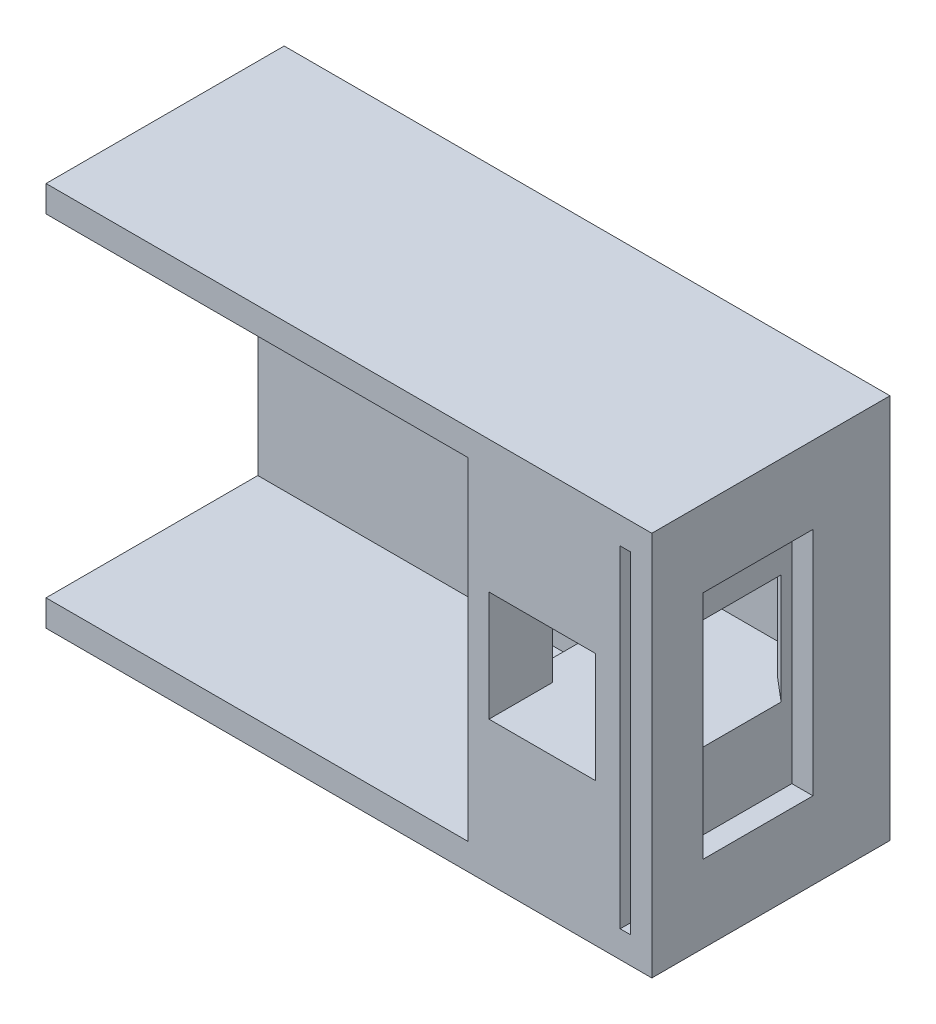
ISO-10303-21;
HEADER;
FILE_DESCRIPTION(('STEP AP214'),'2;1');
FILE_NAME('part.step','',(''),(''),'','','');
FILE_SCHEMA(('AUTOMOTIVE_DESIGN { 1 0 10303 214 1 1 1 1 }'));
ENDSEC;
DATA;
#1=APPLICATION_CONTEXT('core data for automotive mechanical design processes');
#2=APPLICATION_PROTOCOL_DEFINITION('international standard','automotive_design',2000,#1);
#3=PRODUCT_CONTEXT('',#1,'mechanical');
#4=PRODUCT('Part','Part','',(#3));
#5=PRODUCT_RELATED_PRODUCT_CATEGORY('part','',(#4));
#6=PRODUCT_DEFINITION_FORMATION('','',#4);
#7=PRODUCT_DEFINITION_CONTEXT('part definition',#1,'design');
#8=PRODUCT_DEFINITION('design','',#6,#7);
#9=PRODUCT_DEFINITION_SHAPE('','',#8);
#10=(LENGTH_UNIT() NAMED_UNIT(*) SI_UNIT(.MILLI.,.METRE.));
#11=(NAMED_UNIT(*) PLANE_ANGLE_UNIT() SI_UNIT($,.RADIAN.));
#12=(NAMED_UNIT(*) SI_UNIT($,.STERADIAN.) SOLID_ANGLE_UNIT());
#13=UNCERTAINTY_MEASURE_WITH_UNIT(LENGTH_MEASURE(1.E-05),#10,'distance_accuracy_value','');
#14=(GEOMETRIC_REPRESENTATION_CONTEXT(3) GLOBAL_UNCERTAINTY_ASSIGNED_CONTEXT((#13)) GLOBAL_UNIT_ASSIGNED_CONTEXT((#10,
#11,#12)) REPRESENTATION_CONTEXT('',''));
#15=CARTESIAN_POINT('',(0.,0.,0.));
#16=DIRECTION('',(0.,0.,1.));
#17=DIRECTION('',(1.,0.,0.));
#18=AXIS2_PLACEMENT_3D('',#15,#16,#17);
#19=CARTESIAN_POINT('',(101.6,0.,0.));
#20=DIRECTION('',(-1.,0.,0.));
#21=DIRECTION('',(0.,0.,1.));
#22=AXIS2_PLACEMENT_3D('',#19,#20,#21);
#23=PLANE('',#22);
#24=DIRECTION('',(0.,0.,1.));
#25=VECTOR('',#24,1.);
#26=CARTESIAN_POINT('',(101.6,-6.,-2.54));
#27=LINE('',#26,#25);
#28=CARTESIAN_POINT('',(101.6,-6.,-2.54));
#29=VERTEX_POINT('',#28);
#30=CARTESIAN_POINT('',(101.6,-6.,2.54000000000001));
#31=VERTEX_POINT('',#30);
#32=EDGE_CURVE('E362',#29,#31,#27,.T.);
#33=ORIENTED_EDGE('',*,*,#32,.F.);
#34=DIRECTION('',(0.,1.,0.));
#35=VECTOR('',#34,1.);
#36=CARTESIAN_POINT('',(101.6,-6.,-2.54));
#37=LINE('',#36,#35);
#38=CARTESIAN_POINT('',(101.6,7.26,-2.54));
#39=VERTEX_POINT('',#38);
#40=EDGE_CURVE('E402',#29,#39,#37,.T.);
#41=ORIENTED_EDGE('',*,*,#40,.T.);
#42=DIRECTION('',(0.,0.,1.));
#43=VECTOR('',#42,1.);
#44=CARTESIAN_POINT('',(101.6,7.26,-2.54));
#45=LINE('',#44,#43);
#46=CARTESIAN_POINT('',(101.6,7.26,2.54000000000001));
#47=VERTEX_POINT('',#46);
#48=EDGE_CURVE('E332',#39,#47,#45,.T.);
#49=ORIENTED_EDGE('',*,*,#48,.T.);
#50=DIRECTION('',(0.,1.,0.));
#51=VECTOR('',#50,1.);
#52=CARTESIAN_POINT('',(101.6,-6.,2.54000000000001));
#53=LINE('',#52,#51);
#54=EDGE_CURVE('E398',#31,#47,#53,.T.);
#55=ORIENTED_EDGE('',*,*,#54,.F.);
#56=EDGE_LOOP('',(#33,#41,#49,#55));
#57=FACE_BOUND('',#56,.T.);
#58=DIRECTION('',(0.,1.,0.));
#59=VECTOR('',#58,1.);
#60=CARTESIAN_POINT('',(101.6,23.1902,-12.7508));
#61=LINE('',#60,#59);
#62=CARTESIAN_POINT('',(101.6,-20.0152,-12.7508));
#63=VERTEX_POINT('',#62);
#64=CARTESIAN_POINT('',(101.6,20.0152,-12.7508));
#65=VERTEX_POINT('',#64);
#66=EDGE_CURVE('E401',#63,#65,#61,.T.);
#67=ORIENTED_EDGE('',*,*,#66,.F.);
#68=DIRECTION('',(0.,0.,-1.));
#69=VECTOR('',#68,1.);
#70=CARTESIAN_POINT('',(101.6,-20.0152,-12.7508));
#71=LINE('',#70,#69);
#72=CARTESIAN_POINT('',(101.6,-20.0152,12.7508));
#73=VERTEX_POINT('',#72);
#74=EDGE_CURVE('E253',#73,#63,#71,.T.);
#75=ORIENTED_EDGE('',*,*,#74,.F.);
#76=DIRECTION('',(0.,-1.,0.));
#77=VECTOR('',#76,1.);
#78=CARTESIAN_POINT('',(101.6,-23.1902,12.7508));
#79=LINE('',#78,#77);
#80=CARTESIAN_POINT('',(101.6,20.0152,12.7508));
#81=VERTEX_POINT('',#80);
#82=EDGE_CURVE('E432',#81,#73,#79,.T.);
#83=ORIENTED_EDGE('',*,*,#82,.F.);
#84=DIRECTION('',(0.,0.,-1.));
#85=VECTOR('',#84,1.);
#86=CARTESIAN_POINT('',(101.6,20.0152,12.7508));
#87=LINE('',#86,#85);
#88=EDGE_CURVE('E445',#81,#65,#87,.T.);
#89=ORIENTED_EDGE('',*,*,#88,.T.);
#90=EDGE_LOOP('',(#67,#75,#83,#89));
#91=FACE_BOUND('',#90,.T.);
#92=ADVANCED_FACE('F33',(#57,#91),#23,.T.);
#93=CARTESIAN_POINT('',(119.9388,0.,0.));
#94=DIRECTION('',(-1.,0.,0.));
#95=DIRECTION('',(0.,0.,1.));
#96=AXIS2_PLACEMENT_3D('',#93,#94,#95);
#97=PLANE('',#96);
#98=DIRECTION('',(0.,1.,0.));
#99=VECTOR('',#98,1.);
#100=CARTESIAN_POINT('',(119.9388,-6.,-6.62939999999999));
#101=LINE('',#100,#99);
#102=CARTESIAN_POINT('',(119.9388,-6.,-6.62939999999999));
#103=VERTEX_POINT('',#102);
#104=CARTESIAN_POINT('',(119.9388,7.26,-6.62939999999999));
#105=VERTEX_POINT('',#104);
#106=EDGE_CURVE('E414',#103,#105,#101,.T.);
#107=ORIENTED_EDGE('',*,*,#106,.F.);
#108=DIRECTION('',(0.,0.,-1.));
#109=VECTOR('',#108,1.);
#110=CARTESIAN_POINT('',(119.9388,-6.,6.6294));
#111=LINE('',#110,#109);
#112=CARTESIAN_POINT('',(119.9388,-6.,6.6294));
#113=VERTEX_POINT('',#112);
#114=EDGE_CURVE('E344',#113,#103,#111,.T.);
#115=ORIENTED_EDGE('',*,*,#114,.F.);
#116=DIRECTION('',(0.,1.,0.));
#117=VECTOR('',#116,1.);
#118=CARTESIAN_POINT('',(119.9388,-6.,6.6294));
#119=LINE('',#118,#117);
#120=CARTESIAN_POINT('',(119.9388,7.26,6.6294));
#121=VERTEX_POINT('',#120);
#122=EDGE_CURVE('E417',#113,#121,#119,.T.);
#123=ORIENTED_EDGE('',*,*,#122,.T.);
#124=DIRECTION('',(0.,0.,-1.));
#125=VECTOR('',#124,1.);
#126=CARTESIAN_POINT('',(119.9388,7.26,6.6294));
#127=LINE('',#126,#125);
#128=EDGE_CURVE('E380',#121,#105,#127,.T.);
#129=ORIENTED_EDGE('',*,*,#128,.T.);
#130=EDGE_LOOP('',(#107,#115,#123,#129));
#131=FACE_BOUND('',#130,.T.);
#132=DIRECTION('',(0.,0.,1.));
#133=VECTOR('',#132,1.);
#134=CARTESIAN_POINT('',(119.9388,-19.9644,12.7508));
#135=LINE('',#134,#133);
#136=CARTESIAN_POINT('',(119.9388,-19.9644,-12.7));
#137=VERTEX_POINT('',#136);
#138=CARTESIAN_POINT('',(119.9388,-19.9644,12.7508));
#139=VERTEX_POINT('',#138);
#140=EDGE_CURVE('E56',#137,#139,#135,.T.);
#141=ORIENTED_EDGE('',*,*,#140,.F.);
#142=DIRECTION('',(0.,-1.,0.));
#143=VECTOR('',#142,1.);
#144=CARTESIAN_POINT('',(119.9388,-19.9644,-12.7));
#145=LINE('',#144,#143);
#146=CARTESIAN_POINT('',(119.9388,19.9644,-12.7));
#147=VERTEX_POINT('',#146);
#148=EDGE_CURVE('E313',#147,#137,#145,.T.);
#149=ORIENTED_EDGE('',*,*,#148,.F.);
#150=DIRECTION('',(0.,0.,-1.));
#151=VECTOR('',#150,1.);
#152=CARTESIAN_POINT('',(119.9388,19.9644,-12.7));
#153=LINE('',#152,#151);
#154=CARTESIAN_POINT('',(119.9388,19.9644,12.7508));
#155=VERTEX_POINT('',#154);
#156=EDGE_CURVE('E298',#155,#147,#153,.T.);
#157=ORIENTED_EDGE('',*,*,#156,.F.);
#158=DIRECTION('',(0.,-1.,0.));
#159=VECTOR('',#158,1.);
#160=CARTESIAN_POINT('',(119.9388,-23.1902,12.7508));
#161=LINE('',#160,#159);
#162=EDGE_CURVE('E429',#155,#139,#161,.T.);
#163=ORIENTED_EDGE('',*,*,#162,.T.);
#164=EDGE_LOOP('',(#141,#149,#157,#163));
#165=FACE_BOUND('',#164,.T.);
#166=ADVANCED_FACE('F468',(#131,#165),#97,.F.);
#167=CARTESIAN_POINT('',(50.8,20.0152,-12.7508));
#168=DIRECTION('',(-1.,0.,0.));
#169=DIRECTION('',(0.,0.,1.));
#170=AXIS2_PLACEMENT_3D('',#167,#168,#169);
#171=PLANE('',#170);
#172=DIRECTION('',(0.,0.,1.));
#173=VECTOR('',#172,1.);
#174=CARTESIAN_POINT('',(50.8,23.1902,-12.7508));
#175=LINE('',#174,#173);
#176=CARTESIAN_POINT('',(50.8,23.1902,-15.9258));
#177=VERTEX_POINT('',#176);
#178=CARTESIAN_POINT('',(50.8,23.1902,12.7508));
#179=VERTEX_POINT('',#178);
#180=EDGE_CURVE('E438',#177,#179,#175,.T.);
#181=ORIENTED_EDGE('',*,*,#180,.F.);
#182=DIRECTION('',(0.,1.,0.));
#183=VECTOR('',#182,1.);
#184=CARTESIAN_POINT('',(50.8,23.1902,-15.9258));
#185=LINE('',#184,#183);
#186=CARTESIAN_POINT('',(50.8,-23.1902,-15.9258));
#187=VERTEX_POINT('',#186);
#188=EDGE_CURVE('E246',#187,#177,#185,.T.);
#189=ORIENTED_EDGE('',*,*,#188,.F.);
#190=DIRECTION('',(0.,0.,1.));
#191=VECTOR('',#190,1.);
#192=CARTESIAN_POINT('',(50.8,-23.1902,12.7508));
#193=LINE('',#192,#191);
#194=CARTESIAN_POINT('',(50.8,-23.1902,12.7508));
#195=VERTEX_POINT('',#194);
#196=EDGE_CURVE('E255',#187,#195,#193,.T.);
#197=ORIENTED_EDGE('',*,*,#196,.T.);
#198=DIRECTION('',(0.,1.,0.));
#199=VECTOR('',#198,1.);
#200=CARTESIAN_POINT('',(50.8,-20.0152,12.7508));
#201=LINE('',#200,#199);
#202=CARTESIAN_POINT('',(50.8,-20.0152,12.7508));
#203=VERTEX_POINT('',#202);
#204=EDGE_CURVE('E258',#195,#203,#201,.T.);
#205=ORIENTED_EDGE('',*,*,#204,.T.);
#206=DIRECTION('',(0.,0.,-1.));
#207=VECTOR('',#206,1.);
#208=CARTESIAN_POINT('',(50.8,-20.0152,-12.7508));
#209=LINE('',#208,#207);
#210=CARTESIAN_POINT('',(50.8,-20.0152,-12.7508));
#211=VERTEX_POINT('',#210);
#212=EDGE_CURVE('E260',#203,#211,#209,.T.);
#213=ORIENTED_EDGE('',*,*,#212,.T.);
#214=DIRECTION('',(0.,1.,0.));
#215=VECTOR('',#214,1.);
#216=CARTESIAN_POINT('',(50.8,23.1902,-12.7508));
#217=LINE('',#216,#215);
#218=CARTESIAN_POINT('',(50.8,20.0152,-12.7508));
#219=VERTEX_POINT('',#218);
#220=EDGE_CURVE('E247',#211,#219,#217,.T.);
#221=ORIENTED_EDGE('',*,*,#220,.T.);
#222=DIRECTION('',(0.,0.,1.));
#223=VECTOR('',#222,1.);
#224=CARTESIAN_POINT('',(50.8,20.0152,-12.7508));
#225=LINE('',#224,#223);
#226=CARTESIAN_POINT('',(50.8,20.0152,12.7508));
#227=VERTEX_POINT('',#226);
#228=EDGE_CURVE('E439',#219,#227,#225,.T.);
#229=ORIENTED_EDGE('',*,*,#228,.T.);
#230=DIRECTION('',(0.,1.,0.));
#231=VECTOR('',#230,1.);
#232=CARTESIAN_POINT('',(50.8,20.0152,12.7508));
#233=LINE('',#232,#231);
#234=EDGE_CURVE('E11',#227,#179,#233,.T.);
#235=ORIENTED_EDGE('',*,*,#234,.T.);
#236=EDGE_LOOP('',(#181,#189,#197,#205,#213,#221,#229,#235));
#237=FACE_BOUND('',#236,.T.);
#238=ADVANCED_FACE('F35',(#237),#171,.T.);
#239=CARTESIAN_POINT('',(50.8,20.0152,12.7508));
#240=DIRECTION('',(0.,0.,1.));
#241=DIRECTION('',(1.,0.,0.));
#242=AXIS2_PLACEMENT_3D('',#239,#240,#241);
#243=PLANE('',#242);
#244=DIRECTION('',(-1.,0.,0.));
#245=VECTOR('',#244,1.);
#246=CARTESIAN_POINT('',(121.2088,19.9644,12.7508));
#247=LINE('',#246,#245);
#248=CARTESIAN_POINT('',(121.2088,19.9644,12.7508));
#249=VERTEX_POINT('',#248);
#250=EDGE_CURVE('E324',#249,#155,#247,.T.);
#251=ORIENTED_EDGE('',*,*,#250,.F.);
#252=DIRECTION('',(0.,-1.,0.));
#253=VECTOR('',#252,1.);
#254=CARTESIAN_POINT('',(121.2088,-23.1902,12.7508));
#255=LINE('',#254,#253);
#256=CARTESIAN_POINT('',(121.2088,-19.9644,12.7508));
#257=VERTEX_POINT('',#256);
#258=EDGE_CURVE('E230',#249,#257,#255,.T.);
#259=ORIENTED_EDGE('',*,*,#258,.T.);
#260=DIRECTION('',(-1.,0.,0.));
#261=VECTOR('',#260,1.);
#262=CARTESIAN_POINT('',(121.2088,-19.9644,12.7508));
#263=LINE('',#262,#261);
#264=EDGE_CURVE('E310',#257,#139,#263,.T.);
#265=ORIENTED_EDGE('',*,*,#264,.T.);
#266=ORIENTED_EDGE('',*,*,#162,.F.);
#267=EDGE_LOOP('',(#251,#259,#265,#266));
#268=FACE_BOUND('',#267,.T.);
#269=DIRECTION('',(1.,0.,0.));
#270=VECTOR('',#269,1.);
#271=CARTESIAN_POINT('',(104.14,-6.,12.7508));
#272=LINE('',#271,#270);
#273=CARTESIAN_POINT('',(104.14,-6.,12.7508));
#274=VERTEX_POINT('',#273);
#275=CARTESIAN_POINT('',(116.94,-6.,12.7508));
#276=VERTEX_POINT('',#275);
#277=EDGE_CURVE('E335',#274,#276,#272,.T.);
#278=ORIENTED_EDGE('',*,*,#277,.F.);
#279=DIRECTION('',(0.,1.,0.));
#280=VECTOR('',#279,1.);
#281=CARTESIAN_POINT('',(104.14,-6.,12.7508));
#282=LINE('',#281,#280);
#283=CARTESIAN_POINT('',(104.14,7.26,12.7508));
#284=VERTEX_POINT('',#283);
#285=EDGE_CURVE('E425',#274,#284,#282,.T.);
#286=ORIENTED_EDGE('',*,*,#285,.T.);
#287=DIRECTION('',(1.,0.,0.));
#288=VECTOR('',#287,1.);
#289=CARTESIAN_POINT('',(104.14,7.26,12.7508));
#290=LINE('',#289,#288);
#291=CARTESIAN_POINT('',(116.94,7.26,12.7508));
#292=VERTEX_POINT('',#291);
#293=EDGE_CURVE('E371',#284,#292,#290,.T.);
#294=ORIENTED_EDGE('',*,*,#293,.T.);
#295=DIRECTION('',(0.,1.,0.));
#296=VECTOR('',#295,1.);
#297=CARTESIAN_POINT('',(116.94,-6.,12.7508));
#298=LINE('',#297,#296);
#299=EDGE_CURVE('E422',#276,#292,#298,.T.);
#300=ORIENTED_EDGE('',*,*,#299,.F.);
#301=EDGE_LOOP('',(#278,#286,#294,#300));
#302=FACE_BOUND('',#301,.T.);
#303=DIRECTION('',(1.,0.,0.));
#304=VECTOR('',#303,1.);
#305=CARTESIAN_POINT('',(50.8,23.1902,12.7508));
#306=LINE('',#305,#304);
#307=CARTESIAN_POINT('',(123.7488,23.1902,12.7508));
#308=VERTEX_POINT('',#307);
#309=EDGE_CURVE('E225',#179,#308,#306,.T.);
#310=ORIENTED_EDGE('',*,*,#309,.F.);
#311=ORIENTED_EDGE('',*,*,#234,.F.);
#312=DIRECTION('',(1.,0.,0.));
#313=VECTOR('',#312,1.);
#314=CARTESIAN_POINT('',(50.8,20.0152,12.7508));
#315=LINE('',#314,#313);
#316=EDGE_CURVE('E442',#227,#81,#315,.T.);
#317=ORIENTED_EDGE('',*,*,#316,.T.);
#318=ORIENTED_EDGE('',*,*,#82,.T.);
#319=DIRECTION('',(1.,0.,0.));
#320=VECTOR('',#319,1.);
#321=CARTESIAN_POINT('',(50.8,-20.0152,12.7508));
#322=LINE('',#321,#320);
#323=EDGE_CURVE('E48',#203,#73,#322,.T.);
#324=ORIENTED_EDGE('',*,*,#323,.F.);
#325=ORIENTED_EDGE('',*,*,#204,.F.);
#326=DIRECTION('',(-1.,0.,0.));
#327=VECTOR('',#326,1.);
#328=CARTESIAN_POINT('',(119.9388,-23.1902,12.7508));
#329=LINE('',#328,#327);
#330=CARTESIAN_POINT('',(123.7488,-23.1902,12.7508));
#331=VERTEX_POINT('',#330);
#332=EDGE_CURVE('E431',#331,#195,#329,.T.);
#333=ORIENTED_EDGE('',*,*,#332,.F.);
#334=DIRECTION('',(0.,-1.,0.));
#335=VECTOR('',#334,1.);
#336=CARTESIAN_POINT('',(123.7488,-23.1902,12.7508));
#337=LINE('',#336,#335);
#338=EDGE_CURVE('E229',#308,#331,#337,.T.);
#339=ORIENTED_EDGE('',*,*,#338,.F.);
#340=EDGE_LOOP('',(#310,#311,#317,#318,#324,#325,#333,#339));
#341=FACE_BOUND('',#340,.T.);
#342=ADVANCED_FACE('F453',(#268,#302,#341),#243,.T.);
#343=CARTESIAN_POINT('',(0.,20.0152,0.));
#344=DIRECTION('',(0.,1.,0.));
#345=DIRECTION('',(0.,0.,1.));
#346=AXIS2_PLACEMENT_3D('',#343,#344,#345);
#347=PLANE('',#346);
#348=ORIENTED_EDGE('',*,*,#228,.F.);
#349=DIRECTION('',(-1.,0.,0.));
#350=VECTOR('',#349,1.);
#351=CARTESIAN_POINT('',(101.6,20.0152,-12.7508));
#352=LINE('',#351,#350);
#353=EDGE_CURVE('E41',#65,#219,#352,.T.);
#354=ORIENTED_EDGE('',*,*,#353,.F.);
#355=ORIENTED_EDGE('',*,*,#88,.F.);
#356=ORIENTED_EDGE('',*,*,#316,.F.);
#357=EDGE_LOOP('',(#348,#354,#355,#356));
#358=FACE_BOUND('',#357,.T.);
#359=ADVANCED_FACE('F465',(#358),#347,.F.);
#360=CARTESIAN_POINT('',(0.,23.1902,0.));
#361=DIRECTION('',(0.,1.,0.));
#362=DIRECTION('',(0.,0.,1.));
#363=AXIS2_PLACEMENT_3D('',#360,#361,#362);
#364=PLANE('',#363);
#365=ORIENTED_EDGE('',*,*,#180,.T.);
#366=ORIENTED_EDGE('',*,*,#309,.T.);
#367=DIRECTION('',(0.,0.,1.));
#368=VECTOR('',#367,1.);
#369=CARTESIAN_POINT('',(123.7488,23.1902,12.7508));
#370=LINE('',#369,#368);
#371=CARTESIAN_POINT('',(123.7488,23.1902,-15.9258));
#372=VERTEX_POINT('',#371);
#373=EDGE_CURVE('E218',#372,#308,#370,.T.);
#374=ORIENTED_EDGE('',*,*,#373,.F.);
#375=DIRECTION('',(1.,0.,0.));
#376=VECTOR('',#375,1.);
#377=CARTESIAN_POINT('',(123.7488,23.1902,-15.9258));
#378=LINE('',#377,#376);
#379=EDGE_CURVE('E223',#177,#372,#378,.T.);
#380=ORIENTED_EDGE('',*,*,#379,.F.);
#381=EDGE_LOOP('',(#365,#366,#374,#380));
#382=FACE_BOUND('',#381,.T.);
#383=ADVANCED_FACE('F221',(#382),#364,.T.);
#384=CARTESIAN_POINT('',(119.9388,-23.1902,-12.7508));
#385=DIRECTION('',(0.,1.,0.));
#386=DIRECTION('',(0.,0.,1.));
#387=AXIS2_PLACEMENT_3D('',#384,#385,#386);
#388=PLANE('',#387);
#389=ORIENTED_EDGE('',*,*,#332,.T.);
#390=ORIENTED_EDGE('',*,*,#196,.F.);
#391=DIRECTION('',(-1.,0.,0.));
#392=VECTOR('',#391,1.);
#393=CARTESIAN_POINT('',(50.8,-23.1902,-15.9258));
#394=LINE('',#393,#392);
#395=CARTESIAN_POINT('',(123.7488,-23.1902,-15.9258));
#396=VERTEX_POINT('',#395);
#397=EDGE_CURVE('E241',#396,#187,#394,.T.);
#398=ORIENTED_EDGE('',*,*,#397,.F.);
#399=DIRECTION('',(0.,0.,-1.));
#400=VECTOR('',#399,1.);
#401=CARTESIAN_POINT('',(123.7488,-23.1902,-12.7508));
#402=LINE('',#401,#400);
#403=EDGE_CURVE('E237',#331,#396,#402,.T.);
#404=ORIENTED_EDGE('',*,*,#403,.F.);
#405=EDGE_LOOP('',(#389,#390,#398,#404));
#406=FACE_BOUND('',#405,.T.);
#407=ADVANCED_FACE('F456',(#406),#388,.F.);
#408=CARTESIAN_POINT('',(101.6,-6.,2.54000000000001));
#409=DIRECTION('',(-0.707106781186547,0.,0.707106781186548));
#410=DIRECTION('',(0.707106781186548,0.,0.707106781186547));
#411=AXIS2_PLACEMENT_3D('',#408,#409,#410);
#412=PLANE('',#411);
#413=DIRECTION('',(0.707106781186548,0.,0.707106781186547));
#414=VECTOR('',#413,1.);
#415=CARTESIAN_POINT('',(101.6,7.26,2.54000000000001));
#416=LINE('',#415,#414);
#417=CARTESIAN_POINT('',(104.14,7.26,5.08000000000001));
#418=VERTEX_POINT('',#417);
#419=EDGE_CURVE('E327',#47,#418,#416,.T.);
#420=ORIENTED_EDGE('',*,*,#419,.T.);
#421=DIRECTION('',(0.,1.,0.));
#422=VECTOR('',#421,1.);
#423=CARTESIAN_POINT('',(104.14,-6.,5.08000000000001));
#424=LINE('',#423,#422);
#425=CARTESIAN_POINT('',(104.14,-6.,5.08000000000001));
#426=VERTEX_POINT('',#425);
#427=EDGE_CURVE('E365',#426,#418,#424,.T.);
#428=ORIENTED_EDGE('',*,*,#427,.F.);
#429=DIRECTION('',(0.707106781186548,0.,0.707106781186547));
#430=VECTOR('',#429,1.);
#431=CARTESIAN_POINT('',(101.6,-6.,2.54000000000001));
#432=LINE('',#431,#430);
#433=EDGE_CURVE('E328',#31,#426,#432,.T.);
#434=ORIENTED_EDGE('',*,*,#433,.F.);
#435=ORIENTED_EDGE('',*,*,#54,.T.);
#436=EDGE_LOOP('',(#420,#428,#434,#435));
#437=FACE_BOUND('',#436,.T.);
#438=ADVANCED_FACE('F481',(#437),#412,.F.);
#439=CARTESIAN_POINT('',(104.14,-6.,-5.07999999999999));
#440=DIRECTION('',(-0.707106781186547,0.,-0.707106781186548));
#441=DIRECTION('',(-0.707106781186548,0.,0.707106781186547));
#442=AXIS2_PLACEMENT_3D('',#439,#440,#441);
#443=PLANE('',#442);
#444=DIRECTION('',(-0.707106781186548,0.,0.707106781186547));
#445=VECTOR('',#444,1.);
#446=CARTESIAN_POINT('',(104.14,7.26,-5.07999999999999));
#447=LINE('',#446,#445);
#448=CARTESIAN_POINT('',(104.14,7.26,-5.07999999999999));
#449=VERTEX_POINT('',#448);
#450=EDGE_CURVE('E394',#449,#39,#447,.T.);
#451=ORIENTED_EDGE('',*,*,#450,.T.);
#452=ORIENTED_EDGE('',*,*,#40,.F.);
#453=DIRECTION('',(-0.707106781186548,0.,0.707106781186547));
#454=VECTOR('',#453,1.);
#455=CARTESIAN_POINT('',(104.14,-6.,-5.07999999999999));
#456=LINE('',#455,#454);
#457=CARTESIAN_POINT('',(104.14,-6.,-5.07999999999999));
#458=VERTEX_POINT('',#457);
#459=EDGE_CURVE('E359',#458,#29,#456,.T.);
#460=ORIENTED_EDGE('',*,*,#459,.F.);
#461=DIRECTION('',(0.,1.,0.));
#462=VECTOR('',#461,1.);
#463=CARTESIAN_POINT('',(104.14,-6.,-5.07999999999999));
#464=LINE('',#463,#462);
#465=EDGE_CURVE('E405',#458,#449,#464,.T.);
#466=ORIENTED_EDGE('',*,*,#465,.T.);
#467=EDGE_LOOP('',(#451,#452,#460,#466));
#468=FACE_BOUND('',#467,.T.);
#469=ADVANCED_FACE('F529',(#468),#443,.F.);
#470=CARTESIAN_POINT('',(104.14,-6.,-12.7508));
#471=DIRECTION('',(-1.,0.,0.));
#472=DIRECTION('',(0.,0.,1.));
#473=AXIS2_PLACEMENT_3D('',#470,#471,#472);
#474=PLANE('',#473);
#475=DIRECTION('',(0.,0.,1.));
#476=VECTOR('',#475,1.);
#477=CARTESIAN_POINT('',(104.14,7.26,-12.7508));
#478=LINE('',#477,#476);
#479=CARTESIAN_POINT('',(104.14,7.26,-12.7508));
#480=VERTEX_POINT('',#479);
#481=EDGE_CURVE('E391',#480,#449,#478,.T.);
#482=ORIENTED_EDGE('',*,*,#481,.T.);
#483=ORIENTED_EDGE('',*,*,#465,.F.);
#484=DIRECTION('',(0.,0.,1.));
#485=VECTOR('',#484,1.);
#486=CARTESIAN_POINT('',(104.14,-6.,-12.7508));
#487=LINE('',#486,#485);
#488=CARTESIAN_POINT('',(104.14,-6.,-12.7508));
#489=VERTEX_POINT('',#488);
#490=EDGE_CURVE('E356',#489,#458,#487,.T.);
#491=ORIENTED_EDGE('',*,*,#490,.F.);
#492=DIRECTION('',(0.,1.,0.));
#493=VECTOR('',#492,1.);
#494=CARTESIAN_POINT('',(104.14,-6.,-12.7508));
#495=LINE('',#494,#493);
#496=EDGE_CURVE('E407',#489,#480,#495,.T.);
#497=ORIENTED_EDGE('',*,*,#496,.T.);
#498=EDGE_LOOP('',(#482,#483,#491,#497));
#499=FACE_BOUND('',#498,.T.);
#500=ADVANCED_FACE('F511',(#499),#474,.F.);
#501=CARTESIAN_POINT('',(116.94,-6.,-9.16939999999999));
#502=DIRECTION('',(1.,0.,0.));
#503=DIRECTION('',(0.,0.,-1.));
#504=AXIS2_PLACEMENT_3D('',#501,#502,#503);
#505=PLANE('',#504);
#506=DIRECTION('',(0.,0.,-1.));
#507=VECTOR('',#506,1.);
#508=CARTESIAN_POINT('',(116.94,7.26,-9.16939999999999));
#509=LINE('',#508,#507);
#510=CARTESIAN_POINT('',(116.94,7.26,-9.16939999999999));
#511=VERTEX_POINT('',#510);
#512=CARTESIAN_POINT('',(116.94,7.26,-12.7508));
#513=VERTEX_POINT('',#512);
#514=EDGE_CURVE('E386',#511,#513,#509,.T.);
#515=ORIENTED_EDGE('',*,*,#514,.T.);
#516=DIRECTION('',(0.,1.,0.));
#517=VECTOR('',#516,1.);
#518=CARTESIAN_POINT('',(116.94,-6.,-12.7508));
#519=LINE('',#518,#517);
#520=CARTESIAN_POINT('',(116.94,-6.,-12.7508));
#521=VERTEX_POINT('',#520);
#522=EDGE_CURVE('E410',#521,#513,#519,.T.);
#523=ORIENTED_EDGE('',*,*,#522,.F.);
#524=DIRECTION('',(0.,0.,-1.));
#525=VECTOR('',#524,1.);
#526=CARTESIAN_POINT('',(116.94,-6.,-9.16939999999999));
#527=LINE('',#526,#525);
#528=CARTESIAN_POINT('',(116.94,-6.,-9.16939999999999));
#529=VERTEX_POINT('',#528);
#530=EDGE_CURVE('E350',#529,#521,#527,.T.);
#531=ORIENTED_EDGE('',*,*,#530,.F.);
#532=DIRECTION('',(0.,1.,0.));
#533=VECTOR('',#532,1.);
#534=CARTESIAN_POINT('',(116.94,-6.,-9.16939999999999));
#535=LINE('',#534,#533);
#536=EDGE_CURVE('E412',#529,#511,#535,.T.);
#537=ORIENTED_EDGE('',*,*,#536,.T.);
#538=EDGE_LOOP('',(#515,#523,#531,#537));
#539=FACE_BOUND('',#538,.T.);
#540=ADVANCED_FACE('F519',(#539),#505,.F.);
#541=CARTESIAN_POINT('',(119.9388,-6.,-6.62939999999999));
#542=DIRECTION('',(0.646320864244201,0.,-0.763065751061223));
#543=DIRECTION('',(-0.763065751061224,0.,-0.646320864244201));
#544=AXIS2_PLACEMENT_3D('',#541,#542,#543);
#545=PLANE('',#544);
#546=DIRECTION('',(-0.763065751061223,0.,-0.646320864244201));
#547=VECTOR('',#546,1.);
#548=CARTESIAN_POINT('',(119.9388,7.26,-6.62939999999999));
#549=LINE('',#548,#547);
#550=EDGE_CURVE('E383',#105,#511,#549,.T.);
#551=ORIENTED_EDGE('',*,*,#550,.T.);
#552=ORIENTED_EDGE('',*,*,#536,.F.);
#553=DIRECTION('',(-0.763065751061223,0.,-0.646320864244201));
#554=VECTOR('',#553,1.);
#555=CARTESIAN_POINT('',(119.9388,-6.,-6.62939999999999));
#556=LINE('',#555,#554);
#557=EDGE_CURVE('E347',#103,#529,#556,.T.);
#558=ORIENTED_EDGE('',*,*,#557,.F.);
#559=ORIENTED_EDGE('',*,*,#106,.T.);
#560=EDGE_LOOP('',(#551,#552,#558,#559));
#561=FACE_BOUND('',#560,.T.);
#562=ADVANCED_FACE('F522',(#561),#545,.F.);
#563=CARTESIAN_POINT('',(116.94,-6.,9.1694));
#564=DIRECTION('',(0.646320864244201,0.,0.763065751061224));
#565=DIRECTION('',(0.763065751061224,0.,-0.646320864244201));
#566=AXIS2_PLACEMENT_3D('',#563,#564,#565);
#567=PLANE('',#566);
#568=DIRECTION('',(0.763065751061224,0.,-0.646320864244201));
#569=VECTOR('',#568,1.);
#570=CARTESIAN_POINT('',(116.94,7.26,9.1694));
#571=LINE('',#570,#569);
#572=CARTESIAN_POINT('',(116.94,7.26,9.1694));
#573=VERTEX_POINT('',#572);
#574=EDGE_CURVE('E377',#573,#121,#571,.T.);
#575=ORIENTED_EDGE('',*,*,#574,.T.);
#576=ORIENTED_EDGE('',*,*,#122,.F.);
#577=DIRECTION('',(0.763065751061224,0.,-0.646320864244201));
#578=VECTOR('',#577,1.);
#579=CARTESIAN_POINT('',(116.94,-6.,9.1694));
#580=LINE('',#579,#578);
#581=CARTESIAN_POINT('',(116.94,-6.,9.1694));
#582=VERTEX_POINT('',#581);
#583=EDGE_CURVE('E341',#582,#113,#580,.T.);
#584=ORIENTED_EDGE('',*,*,#583,.F.);
#585=DIRECTION('',(0.,1.,0.));
#586=VECTOR('',#585,1.);
#587=CARTESIAN_POINT('',(116.94,-6.,9.1694));
#588=LINE('',#587,#586);
#589=EDGE_CURVE('E420',#582,#573,#588,.T.);
#590=ORIENTED_EDGE('',*,*,#589,.T.);
#591=EDGE_LOOP('',(#575,#576,#584,#590));
#592=FACE_BOUND('',#591,.T.);
#593=ADVANCED_FACE('F526',(#592),#567,.F.);
#594=CARTESIAN_POINT('',(116.94,-6.,12.7508));
#595=DIRECTION('',(1.,0.,0.));
#596=DIRECTION('',(0.,0.,-1.));
#597=AXIS2_PLACEMENT_3D('',#594,#595,#596);
#598=PLANE('',#597);
#599=DIRECTION('',(0.,0.,-1.));
#600=VECTOR('',#599,1.);
#601=CARTESIAN_POINT('',(116.94,7.26,12.7508));
#602=LINE('',#601,#600);
#603=EDGE_CURVE('E374',#292,#573,#602,.T.);
#604=ORIENTED_EDGE('',*,*,#603,.T.);
#605=ORIENTED_EDGE('',*,*,#589,.F.);
#606=DIRECTION('',(0.,0.,-1.));
#607=VECTOR('',#606,1.);
#608=CARTESIAN_POINT('',(116.94,-6.,12.7508));
#609=LINE('',#608,#607);
#610=EDGE_CURVE('E338',#276,#582,#609,.T.);
#611=ORIENTED_EDGE('',*,*,#610,.F.);
#612=ORIENTED_EDGE('',*,*,#299,.T.);
#613=EDGE_LOOP('',(#604,#605,#611,#612));
#614=FACE_BOUND('',#613,.T.);
#615=ADVANCED_FACE('F546',(#614),#598,.F.);
#616=CARTESIAN_POINT('',(104.14,-6.,5.08000000000001));
#617=DIRECTION('',(-1.,0.,0.));
#618=DIRECTION('',(0.,0.,1.));
#619=AXIS2_PLACEMENT_3D('',#616,#617,#618);
#620=PLANE('',#619);
#621=DIRECTION('',(0.,0.,1.));
#622=VECTOR('',#621,1.);
#623=CARTESIAN_POINT('',(104.14,7.26,5.08000000000001));
#624=LINE('',#623,#622);
#625=EDGE_CURVE('E368',#418,#284,#624,.T.);
#626=ORIENTED_EDGE('',*,*,#625,.T.);
#627=ORIENTED_EDGE('',*,*,#285,.F.);
#628=DIRECTION('',(0.,0.,1.));
#629=VECTOR('',#628,1.);
#630=CARTESIAN_POINT('',(104.14,-6.,5.08000000000001));
#631=LINE('',#630,#629);
#632=EDGE_CURVE('E331',#426,#274,#631,.T.);
#633=ORIENTED_EDGE('',*,*,#632,.F.);
#634=ORIENTED_EDGE('',*,*,#427,.T.);
#635=EDGE_LOOP('',(#626,#627,#633,#634));
#636=FACE_BOUND('',#635,.T.);
#637=ADVANCED_FACE('F499',(#636),#620,.F.);
#638=CARTESIAN_POINT('',(0.,-6.,0.));
#639=DIRECTION('',(0.,-1.,0.));
#640=DIRECTION('',(0.,0.,-1.));
#641=AXIS2_PLACEMENT_3D('',#638,#639,#640);
#642=PLANE('',#641);
#643=ORIENTED_EDGE('',*,*,#433,.T.);
#644=ORIENTED_EDGE('',*,*,#632,.T.);
#645=ORIENTED_EDGE('',*,*,#277,.T.);
#646=ORIENTED_EDGE('',*,*,#610,.T.);
#647=ORIENTED_EDGE('',*,*,#583,.T.);
#648=ORIENTED_EDGE('',*,*,#114,.T.);
#649=ORIENTED_EDGE('',*,*,#557,.T.);
#650=ORIENTED_EDGE('',*,*,#530,.T.);
#651=DIRECTION('',(-1.,0.,0.));
#652=VECTOR('',#651,1.);
#653=CARTESIAN_POINT('',(116.94,-6.,-12.7508));
#654=LINE('',#653,#652);
#655=EDGE_CURVE('E353',#521,#489,#654,.T.);
#656=ORIENTED_EDGE('',*,*,#655,.T.);
#657=ORIENTED_EDGE('',*,*,#490,.T.);
#658=ORIENTED_EDGE('',*,*,#459,.T.);
#659=ORIENTED_EDGE('',*,*,#32,.T.);
#660=EDGE_LOOP('',(#643,#644,#645,#646,#647,#648,#649,#650,#656,#657,#658,#659));
#661=FACE_BOUND('',#660,.T.);
#662=ADVANCED_FACE('F496',(#661),#642,.F.);
#663=CARTESIAN_POINT('',(0.,7.26,0.));
#664=DIRECTION('',(0.,-1.,0.));
#665=DIRECTION('',(0.,0.,-1.));
#666=AXIS2_PLACEMENT_3D('',#663,#664,#665);
#667=PLANE('',#666);
#668=ORIENTED_EDGE('',*,*,#419,.F.);
#669=ORIENTED_EDGE('',*,*,#48,.F.);
#670=ORIENTED_EDGE('',*,*,#450,.F.);
#671=ORIENTED_EDGE('',*,*,#481,.F.);
#672=DIRECTION('',(-1.,0.,0.));
#673=VECTOR('',#672,1.);
#674=CARTESIAN_POINT('',(116.94,7.26,-12.7508));
#675=LINE('',#674,#673);
#676=EDGE_CURVE('E389',#513,#480,#675,.T.);
#677=ORIENTED_EDGE('',*,*,#676,.F.);
#678=ORIENTED_EDGE('',*,*,#514,.F.);
#679=ORIENTED_EDGE('',*,*,#550,.F.);
#680=ORIENTED_EDGE('',*,*,#128,.F.);
#681=ORIENTED_EDGE('',*,*,#574,.F.);
#682=ORIENTED_EDGE('',*,*,#603,.F.);
#683=ORIENTED_EDGE('',*,*,#293,.F.);
#684=ORIENTED_EDGE('',*,*,#625,.F.);
#685=EDGE_LOOP('',(#668,#669,#670,#671,#677,#678,#679,#680,#681,#682,#683,#684));
#686=FACE_BOUND('',#685,.T.);
#687=ADVANCED_FACE('F502',(#686),#667,.T.);
#688=CARTESIAN_POINT('',(121.2088,19.9644,-12.7));
#689=DIRECTION('',(0.,1.,0.));
#690=DIRECTION('',(0.,0.,1.));
#691=AXIS2_PLACEMENT_3D('',#688,#689,#690);
#692=PLANE('',#691);
#693=ORIENTED_EDGE('',*,*,#156,.T.);
#694=DIRECTION('',(-1.,0.,0.));
#695=VECTOR('',#694,1.);
#696=CARTESIAN_POINT('',(121.2088,19.9644,-12.7));
#697=LINE('',#696,#695);
#698=CARTESIAN_POINT('',(121.2088,19.9644,-12.7));
#699=VERTEX_POINT('',#698);
#700=EDGE_CURVE('E321',#699,#147,#697,.T.);
#701=ORIENTED_EDGE('',*,*,#700,.F.);
#702=DIRECTION('',(0.,0.,-1.));
#703=VECTOR('',#702,1.);
#704=CARTESIAN_POINT('',(121.2088,19.9644,-12.7));
#705=LINE('',#704,#703);
#706=EDGE_CURVE('E301',#249,#699,#705,.T.);
#707=ORIENTED_EDGE('',*,*,#706,.F.);
#708=ORIENTED_EDGE('',*,*,#250,.T.);
#709=EDGE_LOOP('',(#693,#701,#707,#708));
#710=FACE_BOUND('',#709,.T.);
#711=ADVANCED_FACE('F557',(#710),#692,.F.);
#712=CARTESIAN_POINT('',(121.2088,-19.9644,-12.7));
#713=DIRECTION('',(0.,0.,-1.));
#714=DIRECTION('',(-1.,0.,0.));
#715=AXIS2_PLACEMENT_3D('',#712,#713,#714);
#716=PLANE('',#715);
#717=ORIENTED_EDGE('',*,*,#148,.T.);
#718=DIRECTION('',(-1.,0.,0.));
#719=VECTOR('',#718,1.);
#720=CARTESIAN_POINT('',(121.2088,-19.9644,-12.7));
#721=LINE('',#720,#719);
#722=CARTESIAN_POINT('',(121.2088,-19.9644,-12.7));
#723=VERTEX_POINT('',#722);
#724=EDGE_CURVE('E318',#723,#137,#721,.T.);
#725=ORIENTED_EDGE('',*,*,#724,.F.);
#726=DIRECTION('',(0.,-1.,0.));
#727=VECTOR('',#726,1.);
#728=CARTESIAN_POINT('',(121.2088,-19.9644,-12.7));
#729=LINE('',#728,#727);
#730=EDGE_CURVE('E304',#699,#723,#729,.T.);
#731=ORIENTED_EDGE('',*,*,#730,.F.);
#732=ORIENTED_EDGE('',*,*,#700,.T.);
#733=EDGE_LOOP('',(#717,#725,#731,#732));
#734=FACE_BOUND('',#733,.T.);
#735=ADVANCED_FACE('F561',(#734),#716,.F.);
#736=CARTESIAN_POINT('',(121.2088,-19.9644,12.7508));
#737=DIRECTION('',(0.,-1.,0.));
#738=DIRECTION('',(0.,0.,-1.));
#739=AXIS2_PLACEMENT_3D('',#736,#737,#738);
#740=PLANE('',#739);
#741=ORIENTED_EDGE('',*,*,#140,.T.);
#742=ORIENTED_EDGE('',*,*,#264,.F.);
#743=DIRECTION('',(0.,0.,1.));
#744=VECTOR('',#743,1.);
#745=CARTESIAN_POINT('',(121.2088,-19.9644,12.7508));
#746=LINE('',#745,#744);
#747=EDGE_CURVE('E307',#723,#257,#746,.T.);
#748=ORIENTED_EDGE('',*,*,#747,.F.);
#749=ORIENTED_EDGE('',*,*,#724,.T.);
#750=EDGE_LOOP('',(#741,#742,#748,#749));
#751=FACE_BOUND('',#750,.T.);
#752=ADVANCED_FACE('F565',(#751),#740,.F.);
#753=CARTESIAN_POINT('',(123.7488,0.,0.));
#754=DIRECTION('',(-1.,0.,0.));
#755=DIRECTION('',(0.,0.,1.));
#756=AXIS2_PLACEMENT_3D('',#753,#754,#755);
#757=PLANE('',#756);
#758=ORIENTED_EDGE('',*,*,#403,.T.);
#759=DIRECTION('',(0.,-1.,0.));
#760=VECTOR('',#759,1.);
#761=CARTESIAN_POINT('',(123.7488,-23.1902,-15.9258));
#762=LINE('',#761,#760);
#763=EDGE_CURVE('E233',#372,#396,#762,.T.);
#764=ORIENTED_EDGE('',*,*,#763,.F.);
#765=ORIENTED_EDGE('',*,*,#373,.T.);
#766=ORIENTED_EDGE('',*,*,#338,.T.);
#767=EDGE_LOOP('',(#758,#764,#765,#766));
#768=FACE_BOUND('',#767,.T.);
#769=DIRECTION('',(0.,1.,0.));
#770=VECTOR('',#769,1.);
#771=CARTESIAN_POINT('',(123.7488,-13.8938,-6.65135330643807));
#772=LINE('',#771,#770);
#773=CARTESIAN_POINT('',(123.7488,-13.8938,-6.65135330643807));
#774=VERTEX_POINT('',#773);
#775=CARTESIAN_POINT('',(123.7488,13.8938,-6.65135330643807));
#776=VERTEX_POINT('',#775);
#777=EDGE_CURVE('E268',#774,#776,#772,.T.);
#778=ORIENTED_EDGE('',*,*,#777,.F.);
#779=DIRECTION('',(0.,0.,-1.));
#780=VECTOR('',#779,1.);
#781=CARTESIAN_POINT('',(123.7488,-13.8938,6.60744669356193));
#782=LINE('',#781,#780);
#783=CARTESIAN_POINT('',(123.7488,-13.8938,6.60744669356193));
#784=VERTEX_POINT('',#783);
#785=EDGE_CURVE('E276',#784,#774,#782,.T.);
#786=ORIENTED_EDGE('',*,*,#785,.F.);
#787=DIRECTION('',(0.,-1.,0.));
#788=VECTOR('',#787,1.);
#789=CARTESIAN_POINT('',(123.7488,13.8938,6.60744669356193));
#790=LINE('',#789,#788);
#791=CARTESIAN_POINT('',(123.7488,13.8938,6.60744669356193));
#792=VERTEX_POINT('',#791);
#793=EDGE_CURVE('E273',#792,#784,#790,.T.);
#794=ORIENTED_EDGE('',*,*,#793,.F.);
#795=DIRECTION('',(0.,0.,1.));
#796=VECTOR('',#795,1.);
#797=CARTESIAN_POINT('',(123.7488,13.8938,-6.65135330643807));
#798=LINE('',#797,#796);
#799=EDGE_CURVE('E270',#776,#792,#798,.T.);
#800=ORIENTED_EDGE('',*,*,#799,.F.);
#801=EDGE_LOOP('',(#778,#786,#794,#800));
#802=FACE_BOUND('',#801,.T.);
#803=ADVANCED_FACE('F234',(#768,#802),#757,.F.);
#804=CARTESIAN_POINT('',(121.2088,0.,0.));
#805=DIRECTION('',(-1.,0.,0.));
#806=DIRECTION('',(0.,0.,1.));
#807=AXIS2_PLACEMENT_3D('',#804,#805,#806);
#808=PLANE('',#807);
#809=ORIENTED_EDGE('',*,*,#258,.F.);
#810=ORIENTED_EDGE('',*,*,#706,.T.);
#811=ORIENTED_EDGE('',*,*,#730,.T.);
#812=ORIENTED_EDGE('',*,*,#747,.T.);
#813=EDGE_LOOP('',(#809,#810,#811,#812));
#814=FACE_BOUND('',#813,.T.);
#815=DIRECTION('',(0.,0.,-1.));
#816=VECTOR('',#815,1.);
#817=CARTESIAN_POINT('',(121.2088,-13.8938,6.60744669356193));
#818=LINE('',#817,#816);
#819=CARTESIAN_POINT('',(121.2088,-13.8938,6.60744669356193));
#820=VERTEX_POINT('',#819);
#821=CARTESIAN_POINT('',(121.2088,-13.8938,-6.65135330643807));
#822=VERTEX_POINT('',#821);
#823=EDGE_CURVE('E271',#820,#822,#818,.T.);
#824=ORIENTED_EDGE('',*,*,#823,.T.);
#825=DIRECTION('',(0.,1.,0.));
#826=VECTOR('',#825,1.);
#827=CARTESIAN_POINT('',(121.2088,1.27,-6.65135330643807));
#828=LINE('',#827,#826);
#829=CARTESIAN_POINT('',(121.2088,13.8938,-6.65135330643807));
#830=VERTEX_POINT('',#829);
#831=EDGE_CURVE('E267',#822,#830,#828,.T.);
#832=ORIENTED_EDGE('',*,*,#831,.T.);
#833=DIRECTION('',(0.,0.,1.));
#834=VECTOR('',#833,1.);
#835=CARTESIAN_POINT('',(121.2088,13.8938,-6.65135330643807));
#836=LINE('',#835,#834);
#837=CARTESIAN_POINT('',(121.2088,13.8938,6.60744669356193));
#838=VERTEX_POINT('',#837);
#839=EDGE_CURVE('E281',#830,#838,#836,.T.);
#840=ORIENTED_EDGE('',*,*,#839,.T.);
#841=DIRECTION('',(0.,-1.,0.));
#842=VECTOR('',#841,1.);
#843=CARTESIAN_POINT('',(121.2088,13.8938,6.60744669356193));
#844=LINE('',#843,#842);
#845=EDGE_CURVE('E284',#838,#820,#844,.T.);
#846=ORIENTED_EDGE('',*,*,#845,.T.);
#847=EDGE_LOOP('',(#824,#832,#840,#846));
#848=FACE_BOUND('',#847,.T.);
#849=ADVANCED_FACE('F570',(#814,#848),#808,.T.);
#850=CARTESIAN_POINT('',(123.7488,1.27,-6.65135330643807));
#851=DIRECTION('',(0.,0.,1.));
#852=DIRECTION('',(1.,0.,0.));
#853=AXIS2_PLACEMENT_3D('',#850,#851,#852);
#854=PLANE('',#853);
#855=ORIENTED_EDGE('',*,*,#831,.F.);
#856=DIRECTION('',(-1.,0.,0.));
#857=VECTOR('',#856,1.);
#858=CARTESIAN_POINT('',(123.7488,-13.8938,-6.65135330643807));
#859=LINE('',#858,#857);
#860=EDGE_CURVE('E278',#774,#822,#859,.T.);
#861=ORIENTED_EDGE('',*,*,#860,.F.);
#862=ORIENTED_EDGE('',*,*,#777,.T.);
#863=DIRECTION('',(-1.,0.,0.));
#864=VECTOR('',#863,1.);
#865=CARTESIAN_POINT('',(123.7488,13.8938,-6.65135330643807));
#866=LINE('',#865,#864);
#867=EDGE_CURVE('E294',#776,#830,#866,.T.);
#868=ORIENTED_EDGE('',*,*,#867,.T.);
#869=EDGE_LOOP('',(#855,#861,#862,#868));
#870=FACE_BOUND('',#869,.T.);
#871=ADVANCED_FACE('F573',(#870),#854,.T.);
#872=CARTESIAN_POINT('',(123.7488,13.8938,-6.65135330643807));
#873=DIRECTION('',(0.,-1.,0.));
#874=DIRECTION('',(0.,0.,-1.));
#875=AXIS2_PLACEMENT_3D('',#872,#873,#874);
#876=PLANE('',#875);
#877=ORIENTED_EDGE('',*,*,#839,.F.);
#878=ORIENTED_EDGE('',*,*,#867,.F.);
#879=ORIENTED_EDGE('',*,*,#799,.T.);
#880=DIRECTION('',(-1.,0.,0.));
#881=VECTOR('',#880,1.);
#882=CARTESIAN_POINT('',(123.7488,13.8938,6.60744669356193));
#883=LINE('',#882,#881);
#884=EDGE_CURVE('E292',#792,#838,#883,.T.);
#885=ORIENTED_EDGE('',*,*,#884,.T.);
#886=EDGE_LOOP('',(#877,#878,#879,#885));
#887=FACE_BOUND('',#886,.T.);
#888=ADVANCED_FACE('F579',(#887),#876,.T.);
#889=CARTESIAN_POINT('',(123.7488,13.8938,6.60744669356193));
#890=DIRECTION('',(0.,0.,-1.));
#891=DIRECTION('',(0.,1.,0.));
#892=AXIS2_PLACEMENT_3D('',#889,#890,#891);
#893=PLANE('',#892);
#894=ORIENTED_EDGE('',*,*,#845,.F.);
#895=ORIENTED_EDGE('',*,*,#884,.F.);
#896=ORIENTED_EDGE('',*,*,#793,.T.);
#897=DIRECTION('',(-1.,0.,0.));
#898=VECTOR('',#897,1.);
#899=CARTESIAN_POINT('',(123.7488,-13.8938,6.60744669356193));
#900=LINE('',#899,#898);
#901=EDGE_CURVE('E290',#784,#820,#900,.T.);
#902=ORIENTED_EDGE('',*,*,#901,.T.);
#903=EDGE_LOOP('',(#894,#895,#896,#902));
#904=FACE_BOUND('',#903,.T.);
#905=ADVANCED_FACE('F583',(#904),#893,.T.);
#906=CARTESIAN_POINT('',(123.7488,-13.8938,6.60744669356193));
#907=DIRECTION('',(0.,1.,0.));
#908=DIRECTION('',(0.,0.,1.));
#909=AXIS2_PLACEMENT_3D('',#906,#907,#908);
#910=PLANE('',#909);
#911=ORIENTED_EDGE('',*,*,#823,.F.);
#912=ORIENTED_EDGE('',*,*,#901,.F.);
#913=ORIENTED_EDGE('',*,*,#785,.T.);
#914=ORIENTED_EDGE('',*,*,#860,.T.);
#915=EDGE_LOOP('',(#911,#912,#913,#914));
#916=FACE_BOUND('',#915,.T.);
#917=ADVANCED_FACE('F587',(#916),#910,.T.);
#918=CARTESIAN_POINT('',(50.8,-20.0152,-12.7508));
#919=DIRECTION('',(0.,-1.,0.));
#920=DIRECTION('',(0.,0.,-1.));
#921=AXIS2_PLACEMENT_3D('',#918,#919,#920);
#922=PLANE('',#921);
#923=ORIENTED_EDGE('',*,*,#74,.T.);
#924=DIRECTION('',(1.,0.,0.));
#925=VECTOR('',#924,1.);
#926=CARTESIAN_POINT('',(50.8,-20.0152,-12.7508));
#927=LINE('',#926,#925);
#928=EDGE_CURVE('E262',#211,#63,#927,.T.);
#929=ORIENTED_EDGE('',*,*,#928,.F.);
#930=ORIENTED_EDGE('',*,*,#212,.F.);
#931=ORIENTED_EDGE('',*,*,#323,.T.);
#932=EDGE_LOOP('',(#923,#929,#930,#931));
#933=FACE_BOUND('',#932,.T.);
#934=ADVANCED_FACE('F459',(#933),#922,.F.);
#935=CARTESIAN_POINT('',(0.,0.,-12.7508));
#936=DIRECTION('',(0.,0.,1.));
#937=DIRECTION('',(1.,0.,0.));
#938=AXIS2_PLACEMENT_3D('',#935,#936,#937);
#939=PLANE('',#938);
#940=ORIENTED_EDGE('',*,*,#220,.F.);
#941=ORIENTED_EDGE('',*,*,#928,.T.);
#942=ORIENTED_EDGE('',*,*,#66,.T.);
#943=ORIENTED_EDGE('',*,*,#353,.T.);
#944=EDGE_LOOP('',(#940,#941,#942,#943));
#945=FACE_BOUND('',#944,.T.);
#946=ADVANCED_FACE('F462',(#945),#939,.T.);
#947=CARTESIAN_POINT('',(0.,0.,-15.9258));
#948=DIRECTION('',(0.,0.,1.));
#949=DIRECTION('',(1.,0.,0.));
#950=AXIS2_PLACEMENT_3D('',#947,#948,#949);
#951=PLANE('',#950);
#952=ORIENTED_EDGE('',*,*,#379,.T.);
#953=ORIENTED_EDGE('',*,*,#763,.T.);
#954=ORIENTED_EDGE('',*,*,#397,.T.);
#955=ORIENTED_EDGE('',*,*,#188,.T.);
#956=EDGE_LOOP('',(#952,#953,#954,#955));
#957=FACE_BOUND('',#956,.T.);
#958=ADVANCED_FACE('F244',(#957),#951,.F.);
#959=ORIENTED_EDGE('',*,*,#655,.F.);
#960=ORIENTED_EDGE('',*,*,#522,.T.);
#961=ORIENTED_EDGE('',*,*,#676,.T.);
#962=ORIENTED_EDGE('',*,*,#496,.F.);
#963=EDGE_LOOP('',(#959,#960,#961,#962));
#964=FACE_BOUND('',#963,.T.);
#965=ADVANCED_FACE('F515',(#964),#939,.T.);
#966=CLOSED_SHELL('',(#92,#166,#238,#342,#359,#383,#407,#438,#469,#500,#540,#562,#593,#615,#637,
#662,#687,#711,#735,#752,#803,#849,#871,#888,#905,#917,#934,#946,#958,#965));
#967=MANIFOLD_SOLID_BREP('B2',#966);
#968=ADVANCED_BREP_SHAPE_REPRESENTATION('',(#18,#967),#14);
#969=SHAPE_DEFINITION_REPRESENTATION(#9,#968);
ENDSEC;
END-ISO-10303-21;
